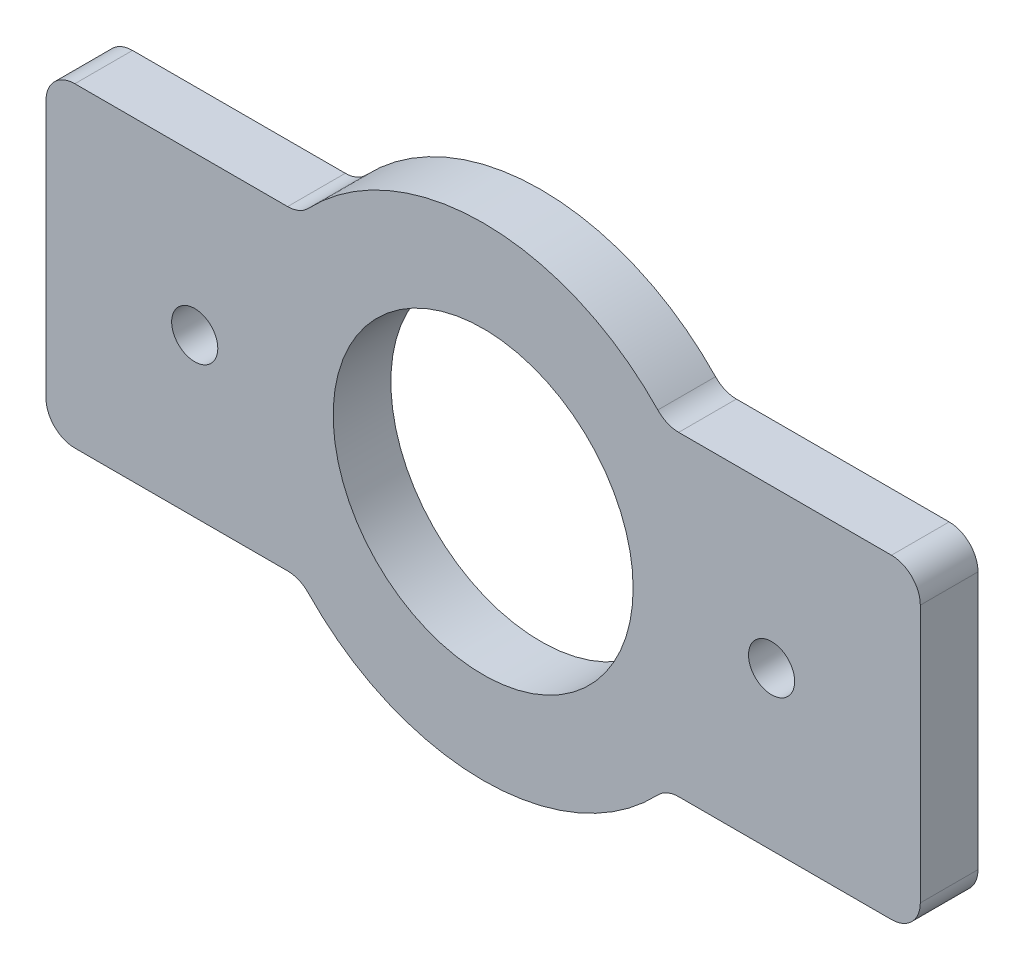
ISO-10303-21;
HEADER;
FILE_DESCRIPTION(('STEP AP214'),'2;1');
FILE_NAME('part.step','',(''),(''),'','','');
FILE_SCHEMA(('AUTOMOTIVE_DESIGN { 1 0 10303 214 1 1 1 1 }'));
ENDSEC;
DATA;
#1=APPLICATION_CONTEXT('core data for automotive mechanical design processes');
#2=APPLICATION_PROTOCOL_DEFINITION('international standard','automotive_design',2000,#1);
#3=PRODUCT_CONTEXT('',#1,'mechanical');
#4=PRODUCT('Part','Part','',(#3));
#5=PRODUCT_RELATED_PRODUCT_CATEGORY('part','',(#4));
#6=PRODUCT_DEFINITION_FORMATION('','',#4);
#7=PRODUCT_DEFINITION_CONTEXT('part definition',#1,'design');
#8=PRODUCT_DEFINITION('design','',#6,#7);
#9=PRODUCT_DEFINITION_SHAPE('','',#8);
#10=(LENGTH_UNIT() NAMED_UNIT(*) SI_UNIT(.MILLI.,.METRE.));
#11=(NAMED_UNIT(*) PLANE_ANGLE_UNIT() SI_UNIT($,.RADIAN.));
#12=(NAMED_UNIT(*) SI_UNIT($,.STERADIAN.) SOLID_ANGLE_UNIT());
#13=UNCERTAINTY_MEASURE_WITH_UNIT(LENGTH_MEASURE(1.E-05),#10,'distance_accuracy_value','');
#14=(GEOMETRIC_REPRESENTATION_CONTEXT(3) GLOBAL_UNCERTAINTY_ASSIGNED_CONTEXT((#13)) GLOBAL_UNIT_ASSIGNED_CONTEXT((#10,
#11,#12)) REPRESENTATION_CONTEXT('',''));
#15=CARTESIAN_POINT('',(0.,0.,0.));
#16=DIRECTION('',(0.,0.,1.));
#17=DIRECTION('',(1.,0.,0.));
#18=AXIS2_PLACEMENT_3D('',#15,#16,#17);
#19=CARTESIAN_POINT('',(0.,0.,10.));
#20=DIRECTION('',(0.,0.,1.));
#21=DIRECTION('',(1.,0.,0.));
#22=AXIS2_PLACEMENT_3D('',#19,#20,#21);
#23=PLANE('',#22);
#24=CARTESIAN_POINT('',(-50.,0.,10.));
#25=DIRECTION('',(0.,0.,1.));
#26=DIRECTION('',(1.,0.,0.));
#27=AXIS2_PLACEMENT_3D('',#24,#25,#26);
#28=CIRCLE('',#27,4.00000000000001);
#29=CARTESIAN_POINT('',(-46.,0.,10.));
#30=VERTEX_POINT('',#29);
#31=EDGE_CURVE('E490',#30,#30,#28,.T.);
#32=ORIENTED_EDGE('',*,*,#31,.F.);
#33=EDGE_LOOP('',(#32));
#34=FACE_BOUND('',#33,.T.);
#35=CARTESIAN_POINT('',(50.,0.,10.));
#36=DIRECTION('',(0.,0.,1.));
#37=DIRECTION('',(1.,0.,0.));
#38=AXIS2_PLACEMENT_3D('',#35,#36,#37);
#39=CIRCLE('',#38,4.00000000000001);
#40=CARTESIAN_POINT('',(54.,0.,10.));
#41=VERTEX_POINT('',#40);
#42=EDGE_CURVE('E498',#41,#41,#39,.T.);
#43=ORIENTED_EDGE('',*,*,#42,.F.);
#44=EDGE_LOOP('',(#43));
#45=FACE_BOUND('',#44,.T.);
#46=DIRECTION('',(1.,0.,0.));
#47=VECTOR('',#46,1.);
#48=CARTESIAN_POINT('',(31.6848024744255,-27.3520447187857,10.));
#49=LINE('',#48,#47);
#50=CARTESIAN_POINT('',(33.8966450404498,-27.3520447187857,10.));
#51=VERTEX_POINT('',#50);
#52=CARTESIAN_POINT('',(70.7825611572153,-27.3520447187857,10.));
#53=VERTEX_POINT('',#52);
#54=EDGE_CURVE('E196',#51,#53,#49,.T.);
#55=ORIENTED_EDGE('',*,*,#54,.T.);
#56=CARTESIAN_POINT('',(70.7825611572153,-22.3520447187857,10.));
#57=DIRECTION('',(0.,0.,1.));
#58=DIRECTION('',(1.,0.,0.));
#59=AXIS2_PLACEMENT_3D('',#56,#57,#58);
#60=CIRCLE('',#59,5.);
#61=CARTESIAN_POINT('',(75.7825611572153,-22.3520447187857,10.));
#62=VERTEX_POINT('',#61);
#63=EDGE_CURVE('E243',#53,#62,#60,.T.);
#64=ORIENTED_EDGE('',*,*,#63,.T.);
#65=DIRECTION('',(0.,1.,0.));
#66=VECTOR('',#65,1.);
#67=CARTESIAN_POINT('',(75.7825611572153,-27.3520447187857,10.));
#68=LINE('',#67,#66);
#69=CARTESIAN_POINT('',(75.7825611572153,22.3520447187857,10.));
#70=VERTEX_POINT('',#69);
#71=EDGE_CURVE('E175',#62,#70,#68,.T.);
#72=ORIENTED_EDGE('',*,*,#71,.T.);
#73=CARTESIAN_POINT('',(70.7825611572153,22.3520447187857,10.));
#74=DIRECTION('',(0.,0.,1.));
#75=DIRECTION('',(1.,0.,0.));
#76=AXIS2_PLACEMENT_3D('',#73,#74,#75);
#77=CIRCLE('',#76,5.);
#78=CARTESIAN_POINT('',(70.7825611572153,27.3520447187857,10.));
#79=VERTEX_POINT('',#78);
#80=EDGE_CURVE('E234',#70,#79,#77,.T.);
#81=ORIENTED_EDGE('',*,*,#80,.T.);
#82=DIRECTION('',(-1.,0.,0.));
#83=VECTOR('',#82,1.);
#84=CARTESIAN_POINT('',(31.6848024744255,27.3520447187857,10.));
#85=LINE('',#84,#83);
#86=CARTESIAN_POINT('',(33.8966450404498,27.3520447187857,10.));
#87=VERTEX_POINT('',#86);
#88=EDGE_CURVE('E333',#79,#87,#85,.T.);
#89=ORIENTED_EDGE('',*,*,#88,.T.);
#90=CARTESIAN_POINT('',(33.8966450404498,32.3520447187857,10.));
#91=DIRECTION('',(0.,0.,1.));
#92=DIRECTION('',(1.,0.,0.));
#93=AXIS2_PLACEMENT_3D('',#90,#91,#92);
#94=CIRCLE('',#93,5.);
#95=CARTESIAN_POINT('',(30.2796624729267,28.8998805995362,10.));
#96=VERTEX_POINT('',#95);
#97=EDGE_CURVE('E301',#87,#96,#94,.F.);
#98=ORIENTED_EDGE('',*,*,#97,.T.);
#99=CARTESIAN_POINT('',(0.,0.,10.));
#100=DIRECTION('',(0.,0.,1.));
#101=DIRECTION('',(1.,0.,0.));
#102=AXIS2_PLACEMENT_3D('',#99,#100,#101);
#103=CIRCLE('',#102,41.8576284342748);
#104=CARTESIAN_POINT('',(-30.2796624729267,28.8998805995362,10.));
#105=VERTEX_POINT('',#104);
#106=EDGE_CURVE('E321',#96,#105,#103,.T.);
#107=ORIENTED_EDGE('',*,*,#106,.T.);
#108=CARTESIAN_POINT('',(-33.8966450404498,32.3520447187857,10.));
#109=DIRECTION('',(0.,0.,1.));
#110=DIRECTION('',(1.,0.,0.));
#111=AXIS2_PLACEMENT_3D('',#108,#109,#110);
#112=CIRCLE('',#111,5.);
#113=CARTESIAN_POINT('',(-33.8966450404498,27.3520447187857,10.));
#114=VERTEX_POINT('',#113);
#115=EDGE_CURVE('E11',#105,#114,#112,.F.);
#116=ORIENTED_EDGE('',*,*,#115,.T.);
#117=DIRECTION('',(-1.,0.,0.));
#118=VECTOR('',#117,1.);
#119=CARTESIAN_POINT('',(-75.7825611572153,27.3520447187857,10.));
#120=LINE('',#119,#118);
#121=CARTESIAN_POINT('',(-70.7825611572153,27.3520447187857,10.));
#122=VERTEX_POINT('',#121);
#123=EDGE_CURVE('E319',#114,#122,#120,.T.);
#124=ORIENTED_EDGE('',*,*,#123,.T.);
#125=CARTESIAN_POINT('',(-70.7825611572153,22.3520447187857,10.));
#126=DIRECTION('',(0.,0.,1.));
#127=DIRECTION('',(1.,0.,0.));
#128=AXIS2_PLACEMENT_3D('',#125,#126,#127);
#129=CIRCLE('',#128,5.);
#130=CARTESIAN_POINT('',(-75.7825611572153,22.3520447187857,10.));
#131=VERTEX_POINT('',#130);
#132=EDGE_CURVE('E237',#122,#131,#129,.T.);
#133=ORIENTED_EDGE('',*,*,#132,.T.);
#134=DIRECTION('',(0.,-1.,0.));
#135=VECTOR('',#134,1.);
#136=CARTESIAN_POINT('',(-75.7825611572153,-27.3520447187857,10.));
#137=LINE('',#136,#135);
#138=CARTESIAN_POINT('',(-75.7825611572153,-22.3520447187857,10.));
#139=VERTEX_POINT('',#138);
#140=EDGE_CURVE('E326',#131,#139,#137,.T.);
#141=ORIENTED_EDGE('',*,*,#140,.T.);
#142=CARTESIAN_POINT('',(-70.7825611572153,-22.3520447187857,10.));
#143=DIRECTION('',(0.,0.,1.));
#144=DIRECTION('',(1.,0.,0.));
#145=AXIS2_PLACEMENT_3D('',#142,#143,#144);
#146=CIRCLE('',#145,5.);
#147=CARTESIAN_POINT('',(-70.7825611572153,-27.3520447187857,10.));
#148=VERTEX_POINT('',#147);
#149=EDGE_CURVE('E240',#139,#148,#146,.T.);
#150=ORIENTED_EDGE('',*,*,#149,.T.);
#151=DIRECTION('',(1.,0.,0.));
#152=VECTOR('',#151,1.);
#153=CARTESIAN_POINT('',(-75.7825611572153,-27.3520447187857,10.));
#154=LINE('',#153,#152);
#155=CARTESIAN_POINT('',(-33.8966450404498,-27.3520447187857,10.));
#156=VERTEX_POINT('',#155);
#157=EDGE_CURVE('E331',#148,#156,#154,.T.);
#158=ORIENTED_EDGE('',*,*,#157,.T.);
#159=CARTESIAN_POINT('',(-33.8966450404498,-32.3520447187857,10.));
#160=DIRECTION('',(0.,0.,1.));
#161=DIRECTION('',(1.,0.,0.));
#162=AXIS2_PLACEMENT_3D('',#159,#160,#161);
#163=CIRCLE('',#162,5.);
#164=CARTESIAN_POINT('',(-30.2796624729267,-28.8998805995362,10.));
#165=VERTEX_POINT('',#164);
#166=EDGE_CURVE('E62',#156,#165,#163,.F.);
#167=ORIENTED_EDGE('',*,*,#166,.T.);
#168=CARTESIAN_POINT('',(0.,0.,10.));
#169=DIRECTION('',(0.,0.,1.));
#170=DIRECTION('',(1.,0.,0.));
#171=AXIS2_PLACEMENT_3D('',#168,#169,#170);
#172=CIRCLE('',#171,41.8576284342748);
#173=CARTESIAN_POINT('',(30.2796624729267,-28.8998805995362,10.));
#174=VERTEX_POINT('',#173);
#175=EDGE_CURVE('E338',#165,#174,#172,.T.);
#176=ORIENTED_EDGE('',*,*,#175,.T.);
#177=CARTESIAN_POINT('',(33.8966450404498,-32.3520447187857,10.));
#178=DIRECTION('',(0.,0.,1.));
#179=DIRECTION('',(1.,0.,0.));
#180=AXIS2_PLACEMENT_3D('',#177,#178,#179);
#181=CIRCLE('',#180,5.);
#182=EDGE_CURVE('E290',#174,#51,#181,.F.);
#183=ORIENTED_EDGE('',*,*,#182,.T.);
#184=EDGE_LOOP('',(#55,#64,#72,#81,#89,#98,#107,#116,#124,#133,#141,#150,#158,#167,#176,#183));
#185=FACE_BOUND('',#184,.T.);
#186=CARTESIAN_POINT('',(0.,0.,10.));
#187=DIRECTION('',(0.,0.,1.));
#188=DIRECTION('',(1.,0.,0.));
#189=AXIS2_PLACEMENT_3D('',#186,#187,#188);
#190=CIRCLE('',#189,26.);
#191=CARTESIAN_POINT('',(26.,0.,10.));
#192=VERTEX_POINT('',#191);
#193=EDGE_CURVE('E185',#192,#192,#190,.T.);
#194=ORIENTED_EDGE('',*,*,#193,.F.);
#195=EDGE_LOOP('',(#194));
#196=FACE_BOUND('',#195,.T.);
#197=ADVANCED_FACE('F39',(#34,#45,#185,#196),#23,.T.);
#198=CARTESIAN_POINT('',(0.,0.,0.));
#199=DIRECTION('',(0.,0.,1.));
#200=DIRECTION('',(1.,0.,0.));
#201=AXIS2_PLACEMENT_3D('',#198,#199,#200);
#202=PLANE('',#201);
#203=CARTESIAN_POINT('',(-50.,0.,0.));
#204=DIRECTION('',(0.,0.,1.));
#205=DIRECTION('',(1.,0.,0.));
#206=AXIS2_PLACEMENT_3D('',#203,#204,#205);
#207=CIRCLE('',#206,4.00000000000001);
#208=CARTESIAN_POINT('',(-46.,0.,0.));
#209=VERTEX_POINT('',#208);
#210=EDGE_CURVE('E488',#209,#209,#207,.T.);
#211=ORIENTED_EDGE('',*,*,#210,.T.);
#212=EDGE_LOOP('',(#211));
#213=FACE_BOUND('',#212,.T.);
#214=CARTESIAN_POINT('',(50.,0.,0.));
#215=DIRECTION('',(0.,0.,1.));
#216=DIRECTION('',(1.,0.,0.));
#217=AXIS2_PLACEMENT_3D('',#214,#215,#216);
#218=CIRCLE('',#217,4.00000000000001);
#219=CARTESIAN_POINT('',(54.,0.,0.));
#220=VERTEX_POINT('',#219);
#221=EDGE_CURVE('E492',#220,#220,#218,.T.);
#222=ORIENTED_EDGE('',*,*,#221,.T.);
#223=EDGE_LOOP('',(#222));
#224=FACE_BOUND('',#223,.T.);
#225=DIRECTION('',(0.,1.,0.));
#226=VECTOR('',#225,1.);
#227=CARTESIAN_POINT('',(75.7825611572153,-27.3520447187857,0.));
#228=LINE('',#227,#226);
#229=CARTESIAN_POINT('',(75.7825611572153,-22.3520447187857,0.));
#230=VERTEX_POINT('',#229);
#231=CARTESIAN_POINT('',(75.7825611572153,22.3520447187857,0.));
#232=VERTEX_POINT('',#231);
#233=EDGE_CURVE('E172',#230,#232,#228,.T.);
#234=ORIENTED_EDGE('',*,*,#233,.F.);
#235=CARTESIAN_POINT('',(70.7825611572153,-22.3520447187857,0.));
#236=DIRECTION('',(0.,0.,1.));
#237=DIRECTION('',(1.,0.,0.));
#238=AXIS2_PLACEMENT_3D('',#235,#236,#237);
#239=CIRCLE('',#238,5.);
#240=CARTESIAN_POINT('',(70.7825611572153,-27.3520447187857,0.));
#241=VERTEX_POINT('',#240);
#242=EDGE_CURVE('E154',#230,#241,#239,.F.);
#243=ORIENTED_EDGE('',*,*,#242,.T.);
#244=DIRECTION('',(1.,0.,0.));
#245=VECTOR('',#244,1.);
#246=CARTESIAN_POINT('',(31.6848024744255,-27.3520447187857,0.));
#247=LINE('',#246,#245);
#248=CARTESIAN_POINT('',(33.8966450404498,-27.3520447187857,0.));
#249=VERTEX_POINT('',#248);
#250=EDGE_CURVE('E217',#249,#241,#247,.T.);
#251=ORIENTED_EDGE('',*,*,#250,.F.);
#252=CARTESIAN_POINT('',(33.8966450404498,-32.3520447187857,0.));
#253=DIRECTION('',(0.,0.,1.));
#254=DIRECTION('',(1.,0.,0.));
#255=AXIS2_PLACEMENT_3D('',#252,#253,#254);
#256=CIRCLE('',#255,5.);
#257=CARTESIAN_POINT('',(30.2796624729267,-28.8998805995362,0.));
#258=VERTEX_POINT('',#257);
#259=EDGE_CURVE('E287',#249,#258,#256,.T.);
#260=ORIENTED_EDGE('',*,*,#259,.T.);
#261=CARTESIAN_POINT('',(0.,0.,0.));
#262=DIRECTION('',(0.,0.,1.));
#263=DIRECTION('',(1.,0.,0.));
#264=AXIS2_PLACEMENT_3D('',#261,#262,#263);
#265=CIRCLE('',#264,41.8576284342748);
#266=CARTESIAN_POINT('',(-30.2796624729267,-28.8998805995362,0.));
#267=VERTEX_POINT('',#266);
#268=EDGE_CURVE('E214',#267,#258,#265,.T.);
#269=ORIENTED_EDGE('',*,*,#268,.F.);
#270=CARTESIAN_POINT('',(-33.8966450404498,-32.3520447187857,0.));
#271=DIRECTION('',(0.,0.,1.));
#272=DIRECTION('',(1.,0.,0.));
#273=AXIS2_PLACEMENT_3D('',#270,#271,#272);
#274=CIRCLE('',#273,5.);
#275=CARTESIAN_POINT('',(-33.8966450404498,-27.3520447187857,0.));
#276=VERTEX_POINT('',#275);
#277=EDGE_CURVE('E293',#267,#276,#274,.T.);
#278=ORIENTED_EDGE('',*,*,#277,.T.);
#279=DIRECTION('',(1.,0.,0.));
#280=VECTOR('',#279,1.);
#281=CARTESIAN_POINT('',(-75.7825611572153,-27.3520447187857,0.));
#282=LINE('',#281,#280);
#283=CARTESIAN_POINT('',(-70.7825611572153,-27.3520447187857,0.));
#284=VERTEX_POINT('',#283);
#285=EDGE_CURVE('E210',#284,#276,#282,.T.);
#286=ORIENTED_EDGE('',*,*,#285,.F.);
#287=CARTESIAN_POINT('',(-70.7825611572153,-22.3520447187857,0.));
#288=DIRECTION('',(0.,0.,1.));
#289=DIRECTION('',(1.,0.,0.));
#290=AXIS2_PLACEMENT_3D('',#287,#288,#289);
#291=CIRCLE('',#290,5.);
#292=CARTESIAN_POINT('',(-75.7825611572153,-22.3520447187857,0.));
#293=VERTEX_POINT('',#292);
#294=EDGE_CURVE('E166',#284,#293,#291,.F.);
#295=ORIENTED_EDGE('',*,*,#294,.T.);
#296=DIRECTION('',(0.,-1.,0.));
#297=VECTOR('',#296,1.);
#298=CARTESIAN_POINT('',(-75.7825611572153,-27.3520447187857,0.));
#299=LINE('',#298,#297);
#300=CARTESIAN_POINT('',(-75.7825611572153,22.3520447187857,0.));
#301=VERTEX_POINT('',#300);
#302=EDGE_CURVE('E206',#301,#293,#299,.T.);
#303=ORIENTED_EDGE('',*,*,#302,.F.);
#304=CARTESIAN_POINT('',(-70.7825611572153,22.3520447187857,0.));
#305=DIRECTION('',(0.,0.,1.));
#306=DIRECTION('',(1.,0.,0.));
#307=AXIS2_PLACEMENT_3D('',#304,#305,#306);
#308=CIRCLE('',#307,5.);
#309=CARTESIAN_POINT('',(-70.7825611572153,27.3520447187857,0.));
#310=VERTEX_POINT('',#309);
#311=EDGE_CURVE('E224',#301,#310,#308,.F.);
#312=ORIENTED_EDGE('',*,*,#311,.T.);
#313=DIRECTION('',(-1.,0.,0.));
#314=VECTOR('',#313,1.);
#315=CARTESIAN_POINT('',(-75.7825611572153,27.3520447187857,0.));
#316=LINE('',#315,#314);
#317=CARTESIAN_POINT('',(-33.8966450404498,27.3520447187857,0.));
#318=VERTEX_POINT('',#317);
#319=EDGE_CURVE('E202',#318,#310,#316,.T.);
#320=ORIENTED_EDGE('',*,*,#319,.F.);
#321=CARTESIAN_POINT('',(-33.8966450404498,32.3520447187857,0.));
#322=DIRECTION('',(0.,0.,1.));
#323=DIRECTION('',(1.,0.,0.));
#324=AXIS2_PLACEMENT_3D('',#321,#322,#323);
#325=CIRCLE('',#324,5.);
#326=CARTESIAN_POINT('',(-30.2796624729267,28.8998805995362,0.));
#327=VERTEX_POINT('',#326);
#328=EDGE_CURVE('E48',#318,#327,#325,.T.);
#329=ORIENTED_EDGE('',*,*,#328,.T.);
#330=CARTESIAN_POINT('',(0.,0.,0.));
#331=DIRECTION('',(0.,0.,1.));
#332=DIRECTION('',(1.,0.,0.));
#333=AXIS2_PLACEMENT_3D('',#330,#331,#332);
#334=CIRCLE('',#333,41.8576284342748);
#335=CARTESIAN_POINT('',(30.2796624729267,28.8998805995362,0.));
#336=VERTEX_POINT('',#335);
#337=EDGE_CURVE('E190',#336,#327,#334,.T.);
#338=ORIENTED_EDGE('',*,*,#337,.F.);
#339=CARTESIAN_POINT('',(33.8966450404498,32.3520447187857,0.));
#340=DIRECTION('',(0.,0.,1.));
#341=DIRECTION('',(1.,0.,0.));
#342=AXIS2_PLACEMENT_3D('',#339,#340,#341);
#343=CIRCLE('',#342,5.);
#344=CARTESIAN_POINT('',(33.8966450404498,27.3520447187857,0.));
#345=VERTEX_POINT('',#344);
#346=EDGE_CURVE('E298',#336,#345,#343,.T.);
#347=ORIENTED_EDGE('',*,*,#346,.T.);
#348=DIRECTION('',(-1.,0.,0.));
#349=VECTOR('',#348,1.);
#350=CARTESIAN_POINT('',(31.6848024744255,27.3520447187857,0.));
#351=LINE('',#350,#349);
#352=CARTESIAN_POINT('',(70.7825611572153,27.3520447187857,0.));
#353=VERTEX_POINT('',#352);
#354=EDGE_CURVE('E184',#353,#345,#351,.T.);
#355=ORIENTED_EDGE('',*,*,#354,.F.);
#356=CARTESIAN_POINT('',(70.7825611572153,22.3520447187857,0.));
#357=DIRECTION('',(0.,0.,1.));
#358=DIRECTION('',(1.,0.,0.));
#359=AXIS2_PLACEMENT_3D('',#356,#357,#358);
#360=CIRCLE('',#359,5.);
#361=EDGE_CURVE('E177',#353,#232,#360,.F.);
#362=ORIENTED_EDGE('',*,*,#361,.T.);
#363=EDGE_LOOP('',(#234,#243,#251,#260,#269,#278,#286,#295,#303,#312,#320,#329,#338,#347,#355,#362));
#364=FACE_BOUND('',#363,.T.);
#365=CARTESIAN_POINT('',(0.,0.,0.));
#366=DIRECTION('',(0.,0.,1.));
#367=DIRECTION('',(1.,0.,0.));
#368=AXIS2_PLACEMENT_3D('',#365,#366,#367);
#369=CIRCLE('',#368,26.);
#370=CARTESIAN_POINT('',(26.,0.,0.));
#371=VERTEX_POINT('',#370);
#372=EDGE_CURVE('E193',#371,#371,#369,.T.);
#373=ORIENTED_EDGE('',*,*,#372,.T.);
#374=EDGE_LOOP('',(#373));
#375=FACE_BOUND('',#374,.T.);
#376=ADVANCED_FACE('F180',(#213,#224,#364,#375),#202,.F.);
#377=CARTESIAN_POINT('',(75.7825611572153,-27.3520447187857,10.));
#378=DIRECTION('',(-1.,0.,0.));
#379=DIRECTION('',(0.,0.,1.));
#380=AXIS2_PLACEMENT_3D('',#377,#378,#379);
#381=PLANE('',#380);
#382=ORIENTED_EDGE('',*,*,#71,.F.);
#383=DIRECTION('',(0.,0.,-1.));
#384=VECTOR('',#383,1.);
#385=CARTESIAN_POINT('',(75.7825611572153,-22.3520447187857,10.));
#386=LINE('',#385,#384);
#387=EDGE_CURVE('E158',#62,#230,#386,.T.);
#388=ORIENTED_EDGE('',*,*,#387,.T.);
#389=ORIENTED_EDGE('',*,*,#233,.T.);
#390=DIRECTION('',(0.,0.,-1.));
#391=VECTOR('',#390,1.);
#392=CARTESIAN_POINT('',(75.7825611572153,22.3520447187857,10.));
#393=LINE('',#392,#391);
#394=EDGE_CURVE('E178',#232,#70,#393,.F.);
#395=ORIENTED_EDGE('',*,*,#394,.T.);
#396=EDGE_LOOP('',(#382,#388,#389,#395));
#397=FACE_BOUND('',#396,.T.);
#398=ADVANCED_FACE('F171',(#397),#381,.F.);
#399=CARTESIAN_POINT('',(31.6848024744255,27.3520447187857,10.));
#400=DIRECTION('',(0.,-1.,0.));
#401=DIRECTION('',(0.,0.,-1.));
#402=AXIS2_PLACEMENT_3D('',#399,#400,#401);
#403=PLANE('',#402);
#404=ORIENTED_EDGE('',*,*,#88,.F.);
#405=DIRECTION('',(0.,0.,-1.));
#406=VECTOR('',#405,1.);
#407=CARTESIAN_POINT('',(70.7825611572153,27.3520447187857,10.));
#408=LINE('',#407,#406);
#409=EDGE_CURVE('E276',#79,#353,#408,.T.);
#410=ORIENTED_EDGE('',*,*,#409,.T.);
#411=ORIENTED_EDGE('',*,*,#354,.T.);
#412=DIRECTION('',(0.,0.,1.));
#413=VECTOR('',#412,1.);
#414=CARTESIAN_POINT('',(33.8966450404498,27.3520447187857,10.));
#415=LINE('',#414,#413);
#416=EDGE_CURVE('E273',#345,#87,#415,.T.);
#417=ORIENTED_EDGE('',*,*,#416,.T.);
#418=EDGE_LOOP('',(#404,#410,#411,#417));
#419=FACE_BOUND('',#418,.T.);
#420=ADVANCED_FACE('F407',(#419),#403,.F.);
#421=CARTESIAN_POINT('',(0.,0.,10.));
#422=DIRECTION('',(0.,0.,-1.));
#423=DIRECTION('',(-1.,0.,0.));
#424=AXIS2_PLACEMENT_3D('',#421,#422,#423);
#425=CYLINDRICAL_SURFACE('',#424,41.8576284342748);
#426=ORIENTED_EDGE('',*,*,#106,.F.);
#427=DIRECTION('',(0.,0.,-1.));
#428=VECTOR('',#427,1.);
#429=CARTESIAN_POINT('',(30.2796624729267,28.8998805995362,10.));
#430=LINE('',#429,#428);
#431=EDGE_CURVE('E283',#96,#336,#430,.T.);
#432=ORIENTED_EDGE('',*,*,#431,.T.);
#433=ORIENTED_EDGE('',*,*,#337,.T.);
#434=DIRECTION('',(0.,0.,-1.));
#435=VECTOR('',#434,1.);
#436=CARTESIAN_POINT('',(-30.2796624729267,28.8998805995362,10.));
#437=LINE('',#436,#435);
#438=EDGE_CURVE('E280',#327,#105,#437,.F.);
#439=ORIENTED_EDGE('',*,*,#438,.T.);
#440=EDGE_LOOP('',(#426,#432,#433,#439));
#441=FACE_BOUND('',#440,.T.);
#442=ADVANCED_FACE('F311',(#441),#425,.T.);
#443=CARTESIAN_POINT('',(-75.7825611572153,27.3520447187857,10.));
#444=DIRECTION('',(0.,-1.,0.));
#445=DIRECTION('',(0.,0.,-1.));
#446=AXIS2_PLACEMENT_3D('',#443,#444,#445);
#447=PLANE('',#446);
#448=ORIENTED_EDGE('',*,*,#319,.T.);
#449=DIRECTION('',(0.,0.,-1.));
#450=VECTOR('',#449,1.);
#451=CARTESIAN_POINT('',(-70.7825611572153,27.3520447187857,10.));
#452=LINE('',#451,#450);
#453=EDGE_CURVE('E270',#310,#122,#452,.F.);
#454=ORIENTED_EDGE('',*,*,#453,.T.);
#455=ORIENTED_EDGE('',*,*,#123,.F.);
#456=DIRECTION('',(0.,0.,1.));
#457=VECTOR('',#456,1.);
#458=CARTESIAN_POINT('',(-33.8966450404498,27.3520447187857,0.));
#459=LINE('',#458,#457);
#460=EDGE_CURVE('E266',#114,#318,#459,.F.);
#461=ORIENTED_EDGE('',*,*,#460,.T.);
#462=EDGE_LOOP('',(#448,#454,#455,#461));
#463=FACE_BOUND('',#462,.T.);
#464=ADVANCED_FACE('F323',(#463),#447,.F.);
#465=CARTESIAN_POINT('',(-75.7825611572153,-27.3520447187857,10.));
#466=DIRECTION('',(1.,0.,0.));
#467=DIRECTION('',(0.,0.,-1.));
#468=AXIS2_PLACEMENT_3D('',#465,#466,#467);
#469=PLANE('',#468);
#470=ORIENTED_EDGE('',*,*,#302,.T.);
#471=DIRECTION('',(0.,0.,-1.));
#472=VECTOR('',#471,1.);
#473=CARTESIAN_POINT('',(-75.7825611572153,-22.3520447187857,10.));
#474=LINE('',#473,#472);
#475=EDGE_CURVE('E263',#293,#139,#474,.F.);
#476=ORIENTED_EDGE('',*,*,#475,.T.);
#477=ORIENTED_EDGE('',*,*,#140,.F.);
#478=DIRECTION('',(0.,0.,-1.));
#479=VECTOR('',#478,1.);
#480=CARTESIAN_POINT('',(-75.7825611572153,22.3520447187857,10.));
#481=LINE('',#480,#479);
#482=EDGE_CURVE('E259',#131,#301,#481,.T.);
#483=ORIENTED_EDGE('',*,*,#482,.T.);
#484=EDGE_LOOP('',(#470,#476,#477,#483));
#485=FACE_BOUND('',#484,.T.);
#486=ADVANCED_FACE('F365',(#485),#469,.F.);
#487=CARTESIAN_POINT('',(-75.7825611572153,-27.3520447187857,10.));
#488=DIRECTION('',(0.,1.,0.));
#489=DIRECTION('',(0.,0.,1.));
#490=AXIS2_PLACEMENT_3D('',#487,#488,#489);
#491=PLANE('',#490);
#492=ORIENTED_EDGE('',*,*,#285,.T.);
#493=DIRECTION('',(0.,0.,1.));
#494=VECTOR('',#493,1.);
#495=CARTESIAN_POINT('',(-33.8966450404498,-27.3520447187857,10.));
#496=LINE('',#495,#494);
#497=EDGE_CURVE('E256',#276,#156,#496,.T.);
#498=ORIENTED_EDGE('',*,*,#497,.T.);
#499=ORIENTED_EDGE('',*,*,#157,.F.);
#500=DIRECTION('',(0.,0.,-1.));
#501=VECTOR('',#500,1.);
#502=CARTESIAN_POINT('',(-70.7825611572153,-27.3520447187857,10.));
#503=LINE('',#502,#501);
#504=EDGE_CURVE('E252',#148,#284,#503,.T.);
#505=ORIENTED_EDGE('',*,*,#504,.T.);
#506=EDGE_LOOP('',(#492,#498,#499,#505));
#507=FACE_BOUND('',#506,.T.);
#508=ADVANCED_FACE('F356',(#507),#491,.F.);
#509=CARTESIAN_POINT('',(0.,0.,10.));
#510=DIRECTION('',(0.,0.,-1.));
#511=DIRECTION('',(-1.,0.,0.));
#512=AXIS2_PLACEMENT_3D('',#509,#510,#511);
#513=CYLINDRICAL_SURFACE('',#512,41.8576284342748);
#514=ORIENTED_EDGE('',*,*,#268,.T.);
#515=DIRECTION('',(0.,0.,-1.));
#516=VECTOR('',#515,1.);
#517=CARTESIAN_POINT('',(30.2796624729267,-28.8998805995362,10.));
#518=LINE('',#517,#516);
#519=EDGE_CURVE('E55',#258,#174,#518,.F.);
#520=ORIENTED_EDGE('',*,*,#519,.T.);
#521=ORIENTED_EDGE('',*,*,#175,.F.);
#522=DIRECTION('',(0.,0.,-1.));
#523=VECTOR('',#522,1.);
#524=CARTESIAN_POINT('',(-30.2796624729267,-28.8998805995362,10.));
#525=LINE('',#524,#523);
#526=EDGE_CURVE('E246',#165,#267,#525,.T.);
#527=ORIENTED_EDGE('',*,*,#526,.T.);
#528=EDGE_LOOP('',(#514,#520,#521,#527));
#529=FACE_BOUND('',#528,.T.);
#530=ADVANCED_FACE('F349',(#529),#513,.T.);
#531=CARTESIAN_POINT('',(31.6848024744255,-27.3520447187857,10.));
#532=DIRECTION('',(0.,1.,0.));
#533=DIRECTION('',(0.,0.,1.));
#534=AXIS2_PLACEMENT_3D('',#531,#532,#533);
#535=PLANE('',#534);
#536=ORIENTED_EDGE('',*,*,#250,.T.);
#537=DIRECTION('',(0.,0.,-1.));
#538=VECTOR('',#537,1.);
#539=CARTESIAN_POINT('',(70.7825611572153,-27.3520447187857,10.));
#540=LINE('',#539,#538);
#541=EDGE_CURVE('E159',#241,#53,#540,.F.);
#542=ORIENTED_EDGE('',*,*,#541,.T.);
#543=ORIENTED_EDGE('',*,*,#54,.F.);
#544=DIRECTION('',(0.,0.,1.));
#545=VECTOR('',#544,1.);
#546=CARTESIAN_POINT('',(33.8966450404498,-27.3520447187857,0.));
#547=LINE('',#546,#545);
#548=EDGE_CURVE('E165',#51,#249,#547,.F.);
#549=ORIENTED_EDGE('',*,*,#548,.T.);
#550=EDGE_LOOP('',(#536,#542,#543,#549));
#551=FACE_BOUND('',#550,.T.);
#552=ADVANCED_FACE('F345',(#551),#535,.F.);
#553=CARTESIAN_POINT('',(0.,0.,10.));
#554=DIRECTION('',(0.,0.,-1.));
#555=DIRECTION('',(-1.,0.,0.));
#556=AXIS2_PLACEMENT_3D('',#553,#554,#555);
#557=CYLINDRICAL_SURFACE('',#556,26.);
#558=ORIENTED_EDGE('',*,*,#193,.T.);
#559=EDGE_LOOP('',(#558));
#560=FACE_BOUND('',#559,.T.);
#561=ORIENTED_EDGE('',*,*,#372,.F.);
#562=EDGE_LOOP('',(#561));
#563=FACE_BOUND('',#562,.T.);
#564=ADVANCED_FACE('F392',(#560,#563),#557,.F.);
#565=CARTESIAN_POINT('',(70.7825611572153,-22.3520447187857,10.));
#566=DIRECTION('',(0.,0.,-1.));
#567=DIRECTION('',(-1.,0.,0.));
#568=AXIS2_PLACEMENT_3D('',#565,#566,#567);
#569=CYLINDRICAL_SURFACE('',#568,5.);
#570=ORIENTED_EDGE('',*,*,#63,.F.);
#571=ORIENTED_EDGE('',*,*,#541,.F.);
#572=ORIENTED_EDGE('',*,*,#242,.F.);
#573=ORIENTED_EDGE('',*,*,#387,.F.);
#574=EDGE_LOOP('',(#570,#571,#572,#573));
#575=FACE_BOUND('',#574,.T.);
#576=ADVANCED_FACE('F157',(#575),#569,.T.);
#577=CARTESIAN_POINT('',(33.8966450404498,-32.3520447187857,10.));
#578=DIRECTION('',(0.,0.,-1.));
#579=DIRECTION('',(-1.,0.,0.));
#580=AXIS2_PLACEMENT_3D('',#577,#578,#579);
#581=CYLINDRICAL_SURFACE('',#580,5.);
#582=ORIENTED_EDGE('',*,*,#182,.F.);
#583=ORIENTED_EDGE('',*,*,#519,.F.);
#584=ORIENTED_EDGE('',*,*,#259,.F.);
#585=ORIENTED_EDGE('',*,*,#548,.F.);
#586=EDGE_LOOP('',(#582,#583,#584,#585));
#587=FACE_BOUND('',#586,.T.);
#588=ADVANCED_FACE('F347',(#587),#581,.F.);
#589=CARTESIAN_POINT('',(-33.8966450404498,-32.3520447187857,10.));
#590=DIRECTION('',(0.,0.,-1.));
#591=DIRECTION('',(-1.,0.,0.));
#592=AXIS2_PLACEMENT_3D('',#589,#590,#591);
#593=CYLINDRICAL_SURFACE('',#592,5.);
#594=ORIENTED_EDGE('',*,*,#166,.F.);
#595=ORIENTED_EDGE('',*,*,#497,.F.);
#596=ORIENTED_EDGE('',*,*,#277,.F.);
#597=ORIENTED_EDGE('',*,*,#526,.F.);
#598=EDGE_LOOP('',(#594,#595,#596,#597));
#599=FACE_BOUND('',#598,.T.);
#600=ADVANCED_FACE('F352',(#599),#593,.F.);
#601=CARTESIAN_POINT('',(-70.7825611572153,-22.3520447187857,10.));
#602=DIRECTION('',(0.,0.,-1.));
#603=DIRECTION('',(-1.,0.,0.));
#604=AXIS2_PLACEMENT_3D('',#601,#602,#603);
#605=CYLINDRICAL_SURFACE('',#604,5.);
#606=ORIENTED_EDGE('',*,*,#149,.F.);
#607=ORIENTED_EDGE('',*,*,#475,.F.);
#608=ORIENTED_EDGE('',*,*,#294,.F.);
#609=ORIENTED_EDGE('',*,*,#504,.F.);
#610=EDGE_LOOP('',(#606,#607,#608,#609));
#611=FACE_BOUND('',#610,.T.);
#612=ADVANCED_FACE('F361',(#611),#605,.T.);
#613=CARTESIAN_POINT('',(-70.7825611572153,22.3520447187857,10.));
#614=DIRECTION('',(0.,0.,-1.));
#615=DIRECTION('',(-1.,0.,0.));
#616=AXIS2_PLACEMENT_3D('',#613,#614,#615);
#617=CYLINDRICAL_SURFACE('',#616,5.);
#618=ORIENTED_EDGE('',*,*,#132,.F.);
#619=ORIENTED_EDGE('',*,*,#453,.F.);
#620=ORIENTED_EDGE('',*,*,#311,.F.);
#621=ORIENTED_EDGE('',*,*,#482,.F.);
#622=EDGE_LOOP('',(#618,#619,#620,#621));
#623=FACE_BOUND('',#622,.T.);
#624=ADVANCED_FACE('F369',(#623),#617,.T.);
#625=CARTESIAN_POINT('',(70.7825611572153,22.3520447187857,10.));
#626=DIRECTION('',(0.,0.,-1.));
#627=DIRECTION('',(-1.,0.,0.));
#628=AXIS2_PLACEMENT_3D('',#625,#626,#627);
#629=CYLINDRICAL_SURFACE('',#628,5.);
#630=ORIENTED_EDGE('',*,*,#80,.F.);
#631=ORIENTED_EDGE('',*,*,#394,.F.);
#632=ORIENTED_EDGE('',*,*,#361,.F.);
#633=ORIENTED_EDGE('',*,*,#409,.F.);
#634=EDGE_LOOP('',(#630,#631,#632,#633));
#635=FACE_BOUND('',#634,.T.);
#636=ADVANCED_FACE('F371',(#635),#629,.T.);
#637=CARTESIAN_POINT('',(33.8966450404498,32.3520447187857,10.));
#638=DIRECTION('',(0.,0.,-1.));
#639=DIRECTION('',(-1.,0.,0.));
#640=AXIS2_PLACEMENT_3D('',#637,#638,#639);
#641=CYLINDRICAL_SURFACE('',#640,5.);
#642=ORIENTED_EDGE('',*,*,#97,.F.);
#643=ORIENTED_EDGE('',*,*,#416,.F.);
#644=ORIENTED_EDGE('',*,*,#346,.F.);
#645=ORIENTED_EDGE('',*,*,#431,.F.);
#646=EDGE_LOOP('',(#642,#643,#644,#645));
#647=FACE_BOUND('',#646,.T.);
#648=ADVANCED_FACE('F377',(#647),#641,.F.);
#649=CARTESIAN_POINT('',(-33.8966450404498,32.3520447187857,10.));
#650=DIRECTION('',(0.,0.,-1.));
#651=DIRECTION('',(-1.,0.,0.));
#652=AXIS2_PLACEMENT_3D('',#649,#650,#651);
#653=CYLINDRICAL_SURFACE('',#652,5.);
#654=ORIENTED_EDGE('',*,*,#115,.F.);
#655=ORIENTED_EDGE('',*,*,#438,.F.);
#656=ORIENTED_EDGE('',*,*,#328,.F.);
#657=ORIENTED_EDGE('',*,*,#460,.F.);
#658=EDGE_LOOP('',(#654,#655,#656,#657));
#659=FACE_BOUND('',#658,.T.);
#660=ADVANCED_FACE('F41',(#659),#653,.F.);
#661=CARTESIAN_POINT('',(50.,0.,0.));
#662=DIRECTION('',(0.,0.,1.));
#663=DIRECTION('',(1.,0.,0.));
#664=AXIS2_PLACEMENT_3D('',#661,#662,#663);
#665=CYLINDRICAL_SURFACE('',#664,4.00000000000001);
#666=ORIENTED_EDGE('',*,*,#221,.F.);
#667=EDGE_LOOP('',(#666));
#668=FACE_BOUND('',#667,.T.);
#669=ORIENTED_EDGE('',*,*,#42,.T.);
#670=EDGE_LOOP('',(#669));
#671=FACE_BOUND('',#670,.T.);
#672=ADVANCED_FACE('F452',(#668,#671),#665,.F.);
#673=CARTESIAN_POINT('',(-50.,0.,0.));
#674=DIRECTION('',(0.,0.,1.));
#675=DIRECTION('',(1.,0.,0.));
#676=AXIS2_PLACEMENT_3D('',#673,#674,#675);
#677=CYLINDRICAL_SURFACE('',#676,4.00000000000001);
#678=ORIENTED_EDGE('',*,*,#210,.F.);
#679=EDGE_LOOP('',(#678));
#680=FACE_BOUND('',#679,.T.);
#681=ORIENTED_EDGE('',*,*,#31,.T.);
#682=EDGE_LOOP('',(#681));
#683=FACE_BOUND('',#682,.T.);
#684=ADVANCED_FACE('F472',(#680,#683),#677,.F.);
#685=CLOSED_SHELL('',(#197,#376,#398,#420,#442,#464,#486,#508,#530,#552,#564,#576,#588,#600,
#612,#624,#636,#648,#660,#672,#684));
#686=MANIFOLD_SOLID_BREP('B2',#685);
#687=ADVANCED_BREP_SHAPE_REPRESENTATION('',(#18,#686),#14);
#688=SHAPE_DEFINITION_REPRESENTATION(#9,#687);
ENDSEC;
END-ISO-10303-21;
